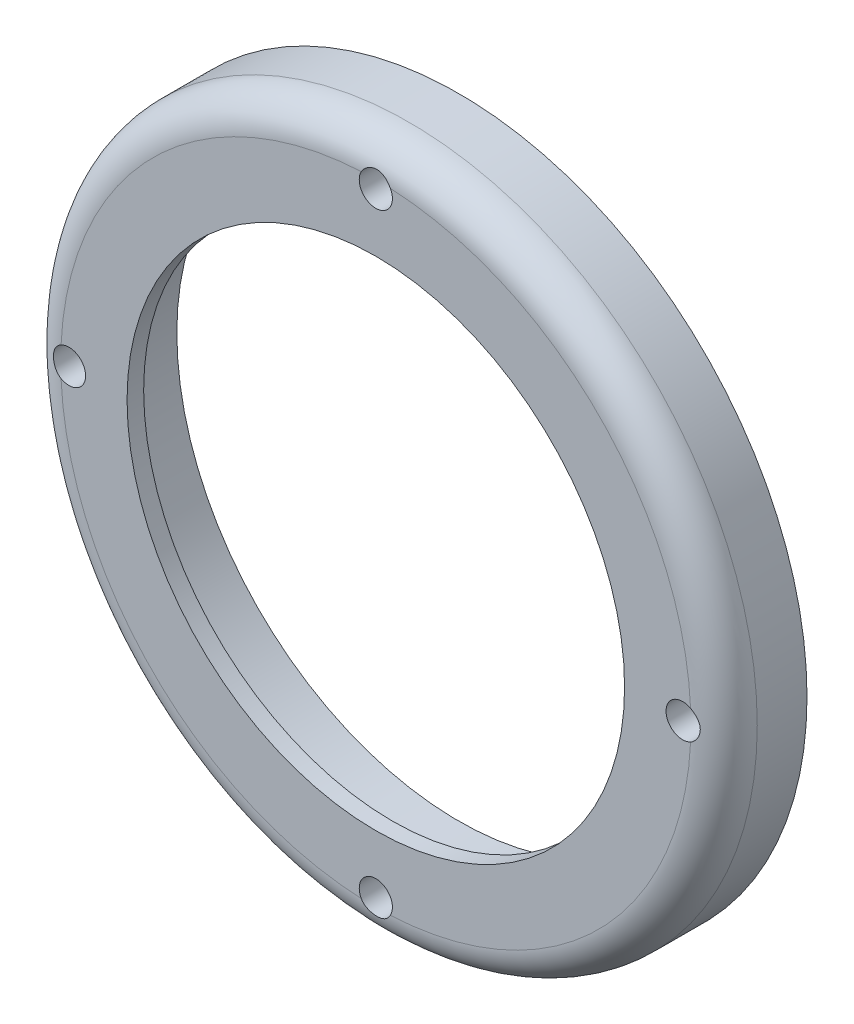
ISO-10303-21;
HEADER;
FILE_DESCRIPTION(('STEP AP214'),'2;1');
FILE_NAME('part.step','',(''),(''),'','','');
FILE_SCHEMA(('AUTOMOTIVE_DESIGN { 1 0 10303 214 1 1 1 1 }'));
ENDSEC;
DATA;
#1=APPLICATION_CONTEXT('core data for automotive mechanical design processes');
#2=APPLICATION_PROTOCOL_DEFINITION('international standard','automotive_design',2000,#1);
#3=PRODUCT_CONTEXT('',#1,'mechanical');
#4=PRODUCT('Part','Part','',(#3));
#5=PRODUCT_RELATED_PRODUCT_CATEGORY('part','',(#4));
#6=PRODUCT_DEFINITION_FORMATION('','',#4);
#7=PRODUCT_DEFINITION_CONTEXT('part definition',#1,'design');
#8=PRODUCT_DEFINITION('design','',#6,#7);
#9=PRODUCT_DEFINITION_SHAPE('','',#8);
#10=(LENGTH_UNIT() NAMED_UNIT(*) SI_UNIT(.MILLI.,.METRE.));
#11=(NAMED_UNIT(*) PLANE_ANGLE_UNIT() SI_UNIT($,.RADIAN.));
#12=(NAMED_UNIT(*) SI_UNIT($,.STERADIAN.) SOLID_ANGLE_UNIT());
#13=UNCERTAINTY_MEASURE_WITH_UNIT(LENGTH_MEASURE(1.E-05),#10,'distance_accuracy_value','');
#14=(GEOMETRIC_REPRESENTATION_CONTEXT(3) GLOBAL_UNCERTAINTY_ASSIGNED_CONTEXT((#13)) GLOBAL_UNIT_ASSIGNED_CONTEXT((#10,
#11,#12)) REPRESENTATION_CONTEXT('',''));
#15=CARTESIAN_POINT('',(0.,0.,0.));
#16=DIRECTION('',(0.,0.,1.));
#17=DIRECTION('',(1.,0.,0.));
#18=AXIS2_PLACEMENT_3D('',#15,#16,#17);
#19=CARTESIAN_POINT('',(0.,0.,20.));
#20=DIRECTION('',(0.,0.,-1.));
#21=DIRECTION('',(-1.,0.,0.));
#22=AXIS2_PLACEMENT_3D('',#19,#20,#21);
#23=CYLINDRICAL_SURFACE('',#22,52.5);
#24=CARTESIAN_POINT('',(0.,0.,7.5));
#25=DIRECTION('',(0.,0.,1.));
#26=DIRECTION('',(1.,0.,0.));
#27=AXIS2_PLACEMENT_3D('',#24,#25,#26);
#28=CIRCLE('',#27,52.5);
#29=CARTESIAN_POINT('',(52.5,0.,7.5));
#30=VERTEX_POINT('',#29);
#31=EDGE_CURVE('E90',#30,#30,#28,.F.);
#32=ORIENTED_EDGE('',*,*,#31,.T.);
#33=EDGE_LOOP('',(#32));
#34=FACE_BOUND('',#33,.T.);
#35=CARTESIAN_POINT('',(0.,0.,0.));
#36=DIRECTION('',(0.,0.,1.));
#37=DIRECTION('',(1.,0.,0.));
#38=AXIS2_PLACEMENT_3D('',#35,#36,#37);
#39=CIRCLE('',#38,52.5);
#40=CARTESIAN_POINT('',(52.5,0.,0.));
#41=VERTEX_POINT('',#40);
#42=EDGE_CURVE('E109',#41,#41,#39,.T.);
#43=ORIENTED_EDGE('',*,*,#42,.T.);
#44=EDGE_LOOP('',(#43));
#45=FACE_BOUND('',#44,.T.);
#46=ADVANCED_FACE('F36',(#34,#45),#23,.T.);
#47=CARTESIAN_POINT('',(0.,0.,0.));
#48=DIRECTION('',(0.,0.,1.));
#49=DIRECTION('',(1.,0.,0.));
#50=AXIS2_PLACEMENT_3D('',#47,#48,#49);
#51=PLANE('',#50);
#52=CARTESIAN_POINT('',(46.25,0.,0.));
#53=DIRECTION('',(0.,0.,1.));
#54=DIRECTION('',(1.,0.,0.));
#55=AXIS2_PLACEMENT_3D('',#52,#53,#54);
#56=CIRCLE('',#55,1.5);
#57=CARTESIAN_POINT('',(47.75,0.,0.));
#58=VERTEX_POINT('',#57);
#59=EDGE_CURVE('E199',#58,#58,#56,.T.);
#60=ORIENTED_EDGE('',*,*,#59,.T.);
#61=EDGE_LOOP('',(#60));
#62=FACE_BOUND('',#61,.T.);
#63=CARTESIAN_POINT('',(-46.25,0.,0.));
#64=DIRECTION('',(0.,0.,1.));
#65=DIRECTION('',(1.,0.,0.));
#66=AXIS2_PLACEMENT_3D('',#63,#64,#65);
#67=CIRCLE('',#66,1.5);
#68=CARTESIAN_POINT('',(-44.75,0.,0.));
#69=VERTEX_POINT('',#68);
#70=EDGE_CURVE('E193',#69,#69,#67,.T.);
#71=ORIENTED_EDGE('',*,*,#70,.T.);
#72=EDGE_LOOP('',(#71));
#73=FACE_BOUND('',#72,.T.);
#74=CARTESIAN_POINT('',(0.,-46.25,0.));
#75=DIRECTION('',(0.,0.,1.));
#76=DIRECTION('',(1.,0.,0.));
#77=AXIS2_PLACEMENT_3D('',#74,#75,#76);
#78=CIRCLE('',#77,1.5);
#79=CARTESIAN_POINT('',(1.5,-46.25,0.));
#80=VERTEX_POINT('',#79);
#81=EDGE_CURVE('E187',#80,#80,#78,.T.);
#82=ORIENTED_EDGE('',*,*,#81,.T.);
#83=EDGE_LOOP('',(#82));
#84=FACE_BOUND('',#83,.T.);
#85=CARTESIAN_POINT('',(0.,46.25,0.));
#86=DIRECTION('',(0.,0.,1.));
#87=DIRECTION('',(1.,0.,0.));
#88=AXIS2_PLACEMENT_3D('',#85,#86,#87);
#89=CIRCLE('',#88,1.5);
#90=CARTESIAN_POINT('',(1.5,46.25,0.));
#91=VERTEX_POINT('',#90);
#92=EDGE_CURVE('E100',#91,#91,#89,.T.);
#93=ORIENTED_EDGE('',*,*,#92,.T.);
#94=EDGE_LOOP('',(#93));
#95=FACE_BOUND('',#94,.T.);
#96=CARTESIAN_POINT('',(0.,0.,0.));
#97=DIRECTION('',(0.,0.,-1.));
#98=DIRECTION('',(-1.,0.,0.));
#99=AXIS2_PLACEMENT_3D('',#96,#97,#98);
#100=CIRCLE('',#99,42.5);
#101=CARTESIAN_POINT('',(-42.5,0.,0.));
#102=VERTEX_POINT('',#101);
#103=EDGE_CURVE('E157',#102,#102,#100,.T.);
#104=ORIENTED_EDGE('',*,*,#103,.F.);
#105=EDGE_LOOP('',(#104));
#106=FACE_BOUND('',#105,.T.);
#107=ORIENTED_EDGE('',*,*,#42,.F.);
#108=EDGE_LOOP('',(#107));
#109=FACE_BOUND('',#108,.T.);
#110=ADVANCED_FACE('F142',(#62,#73,#84,#95,#106,#109),#51,.F.);
#111=CARTESIAN_POINT('',(0.,0.,10.));
#112=DIRECTION('',(0.,0.,-1.));
#113=DIRECTION('',(-1.,0.,0.));
#114=AXIS2_PLACEMENT_3D('',#111,#112,#113);
#115=CYLINDRICAL_SURFACE('',#114,42.5);
#116=CARTESIAN_POINT('',(0.,0.,10.));
#117=DIRECTION('',(0.,0.,-1.));
#118=DIRECTION('',(-1.,0.,0.));
#119=AXIS2_PLACEMENT_3D('',#116,#117,#118);
#120=CIRCLE('',#119,42.5);
#121=CARTESIAN_POINT('',(-42.5,0.,10.));
#122=VERTEX_POINT('',#121);
#123=EDGE_CURVE('E155',#122,#122,#120,.T.);
#124=ORIENTED_EDGE('',*,*,#123,.F.);
#125=EDGE_LOOP('',(#124));
#126=FACE_BOUND('',#125,.T.);
#127=ORIENTED_EDGE('',*,*,#103,.T.);
#128=EDGE_LOOP('',(#127));
#129=FACE_BOUND('',#128,.T.);
#130=ADVANCED_FACE('F138',(#126,#129),#115,.F.);
#131=CARTESIAN_POINT('',(0.,0.,10.));
#132=DIRECTION('',(0.,0.,-1.));
#133=DIRECTION('',(-1.,0.,0.));
#134=AXIS2_PLACEMENT_3D('',#131,#132,#133);
#135=PLANE('',#134);
#136=CARTESIAN_POINT('',(0.,0.,10.));
#137=DIRECTION('',(0.,0.,-1.));
#138=DIRECTION('',(-1.,0.,0.));
#139=AXIS2_PLACEMENT_3D('',#136,#137,#138);
#140=CIRCLE('',#139,37.5);
#141=CARTESIAN_POINT('',(-37.5,0.,10.));
#142=VERTEX_POINT('',#141);
#143=EDGE_CURVE('E164',#142,#142,#140,.T.);
#144=ORIENTED_EDGE('',*,*,#143,.F.);
#145=EDGE_LOOP('',(#144));
#146=FACE_BOUND('',#145,.T.);
#147=ORIENTED_EDGE('',*,*,#123,.T.);
#148=EDGE_LOOP('',(#147));
#149=FACE_BOUND('',#148,.T.);
#150=ADVANCED_FACE('F135',(#146,#149),#135,.T.);
#151=CARTESIAN_POINT('',(0.,0.,12.5));
#152=DIRECTION('',(0.,0.,1.));
#153=DIRECTION('',(1.,0.,0.));
#154=AXIS2_PLACEMENT_3D('',#151,#152,#153);
#155=PLANE('',#154);
#156=CARTESIAN_POINT('',(0.,46.25,12.5));
#157=DIRECTION('',(0.,0.,1.));
#158=DIRECTION('',(1.,0.,0.));
#159=AXIS2_PLACEMENT_3D('',#156,#157,#158);
#160=CIRCLE('',#159,2.5);
#161=CARTESIAN_POINT('',(-2.19354078263524,47.4493243243243,12.5));
#162=VERTEX_POINT('',#161);
#163=CARTESIAN_POINT('',(2.19354078263524,47.4493243243243,12.5));
#164=VERTEX_POINT('',#163);
#165=EDGE_CURVE('E180',#162,#164,#160,.T.);
#166=ORIENTED_EDGE('',*,*,#165,.F.);
#167=CARTESIAN_POINT('',(0.,0.,12.5));
#168=DIRECTION('',(0.,0.,1.));
#169=DIRECTION('',(1.,0.,0.));
#170=AXIS2_PLACEMENT_3D('',#167,#168,#169);
#171=CIRCLE('',#170,47.5);
#172=CARTESIAN_POINT('',(-47.4493243243243,2.19354078263524,12.5));
#173=VERTEX_POINT('',#172);
#174=EDGE_CURVE('E98',#162,#173,#171,.T.);
#175=ORIENTED_EDGE('',*,*,#174,.T.);
#176=CARTESIAN_POINT('',(-46.25,0.,12.5));
#177=DIRECTION('',(0.,0.,1.));
#178=DIRECTION('',(1.,0.,0.));
#179=AXIS2_PLACEMENT_3D('',#176,#177,#178);
#180=CIRCLE('',#179,2.5);
#181=CARTESIAN_POINT('',(-47.4493243243243,-2.19354078263524,12.5));
#182=VERTEX_POINT('',#181);
#183=EDGE_CURVE('E84',#182,#173,#180,.T.);
#184=ORIENTED_EDGE('',*,*,#183,.F.);
#185=CARTESIAN_POINT('',(-2.19354078263524,-47.4493243243243,12.5));
#186=VERTEX_POINT('',#185);
#187=EDGE_CURVE('E97',#182,#186,#171,.T.);
#188=ORIENTED_EDGE('',*,*,#187,.T.);
#189=CARTESIAN_POINT('',(0.,-46.25,12.5));
#190=DIRECTION('',(0.,0.,1.));
#191=DIRECTION('',(1.,0.,0.));
#192=AXIS2_PLACEMENT_3D('',#189,#190,#191);
#193=CIRCLE('',#192,2.5);
#194=CARTESIAN_POINT('',(2.19354078263524,-47.4493243243243,12.5));
#195=VERTEX_POINT('',#194);
#196=EDGE_CURVE('E62',#195,#186,#193,.T.);
#197=ORIENTED_EDGE('',*,*,#196,.F.);
#198=CARTESIAN_POINT('',(47.4493243243243,-2.19354078263524,12.5));
#199=VERTEX_POINT('',#198);
#200=EDGE_CURVE('E105',#195,#199,#171,.T.);
#201=ORIENTED_EDGE('',*,*,#200,.T.);
#202=CARTESIAN_POINT('',(46.25,0.,12.5));
#203=DIRECTION('',(0.,0.,1.));
#204=DIRECTION('',(1.,0.,0.));
#205=AXIS2_PLACEMENT_3D('',#202,#203,#204);
#206=CIRCLE('',#205,2.5);
#207=CARTESIAN_POINT('',(47.4493243243243,2.19354078263524,12.5));
#208=VERTEX_POINT('',#207);
#209=EDGE_CURVE('E55',#208,#199,#206,.T.);
#210=ORIENTED_EDGE('',*,*,#209,.F.);
#211=EDGE_CURVE('E107',#208,#164,#171,.T.);
#212=ORIENTED_EDGE('',*,*,#211,.T.);
#213=EDGE_LOOP('',(#166,#175,#184,#188,#197,#201,#210,#212));
#214=FACE_BOUND('',#213,.T.);
#215=CARTESIAN_POINT('',(0.,0.,12.5));
#216=DIRECTION('',(0.,0.,-1.));
#217=DIRECTION('',(-1.,0.,0.));
#218=AXIS2_PLACEMENT_3D('',#215,#216,#217);
#219=CIRCLE('',#218,37.5);
#220=CARTESIAN_POINT('',(-37.5,0.,12.5));
#221=VERTEX_POINT('',#220);
#222=EDGE_CURVE('E162',#221,#221,#219,.T.);
#223=ORIENTED_EDGE('',*,*,#222,.T.);
#224=EDGE_LOOP('',(#223));
#225=FACE_BOUND('',#224,.T.);
#226=ADVANCED_FACE('F95',(#214,#225),#155,.T.);
#227=CARTESIAN_POINT('',(0.,0.,12.5));
#228=DIRECTION('',(0.,0.,-1.));
#229=DIRECTION('',(-1.,0.,0.));
#230=AXIS2_PLACEMENT_3D('',#227,#228,#229);
#231=CYLINDRICAL_SURFACE('',#230,37.5);
#232=ORIENTED_EDGE('',*,*,#222,.F.);
#233=EDGE_LOOP('',(#232));
#234=FACE_BOUND('',#233,.T.);
#235=ORIENTED_EDGE('',*,*,#143,.T.);
#236=EDGE_LOOP('',(#235));
#237=FACE_BOUND('',#236,.T.);
#238=ADVANCED_FACE('F129',(#234,#237),#231,.F.);
#239=CARTESIAN_POINT('',(0.,0.,7.5));
#240=DIRECTION('',(0.,0.,1.));
#241=DIRECTION('',(1.,0.,0.));
#242=AXIS2_PLACEMENT_3D('',#239,#240,#241);
#243=TOROIDAL_SURFACE('',#242,47.5,5.);
#244=CARTESIAN_POINT('',(-1.40418270651494,44.1816018452135,11.2597595084674));
#245=CARTESIAN_POINT('',(-1.3114488943393,44.1186426591774,11.2020043959019));
#246=CARTESIAN_POINT('',(-1.21355225182356,44.061270164693,11.1461672668494));
#247=CARTESIAN_POINT('',(-1.00731593288184,43.959026218572,11.0422957952221));
#248=CARTESIAN_POINT('',(-0.898966668150176,43.9141663945541,10.9942687274478));
#249=CARTESIAN_POINT('',(-0.695145930001762,43.8467000004861,10.9198048894202));
#250=CARTESIAN_POINT('',(-0.601457741075006,43.8214336939323,10.8909692369789));
#251=CARTESIAN_POINT('',(-0.40911982041811,43.7817578416228,10.8450101785638));
#252=CARTESIAN_POINT('',(-0.310481298826818,43.7673248508224,10.8278614875702));
#253=CARTESIAN_POINT('',(-0.109938511774165,43.750381761955,10.8076789049674));
#254=CARTESIAN_POINT('',(-0.00801558094625604,43.7479600157126,10.8047496111604));
#255=CARTESIAN_POINT('',(0.194719358604004,43.7555270278607,10.8138061058862));
#256=CARTESIAN_POINT('',(0.295530562255162,43.7655242514959,10.8258020680527));
#257=CARTESIAN_POINT('',(0.502899905389215,43.7986255462218,10.8646571744916));
#258=CARTESIAN_POINT('',(0.608986848943493,43.8229688574144,10.8929146839688));
#259=CARTESIAN_POINT('',(0.813764108487216,43.8837254011589,10.9609800045866));
#260=CARTESIAN_POINT('',(0.912437369167845,43.920165479142,11.0008134806713));
#261=CARTESIAN_POINT('',(1.14218047857569,44.0212692462236,11.1066051039355));
#262=CARTESIAN_POINT('',(1.26905512002437,44.0913382213022,11.1764499603316));
#263=CARTESIAN_POINT('',(1.50647165449171,44.2497615382026,11.3227283930393));
#264=CARTESIAN_POINT('',(1.6169896031965,44.3381422411535,11.3991713742624));
#265=CARTESIAN_POINT('',(1.82471664663023,44.534920114695,11.5552317479849));
#266=CARTESIAN_POINT('',(1.9213911088308,44.6438641876363,11.6348728135146));
#267=CARTESIAN_POINT('',(2.09545761934986,44.8787331881972,11.7898924019857));
#268=CARTESIAN_POINT('',(2.17287187675999,45.004638297132,11.8652757562299));
#269=CARTESIAN_POINT('',(2.29795313285243,45.256606575861,11.9993177362122));
#270=CARTESIAN_POINT('',(2.34802162688877,45.3809757909418,12.0589025260389));
#271=CARTESIAN_POINT('',(2.42820743464258,45.6399582939292,12.1686611258076));
#272=CARTESIAN_POINT('',(2.45833362957443,45.7745669919089,12.2188391178789));
#273=CARTESIAN_POINT('',(2.49605462431406,46.051609919271,12.3077964333225));
#274=CARTESIAN_POINT('',(2.50350573202309,46.1940882535696,12.346501665419));
#275=CARTESIAN_POINT('',(2.49342317176478,46.4811303881585,12.4107098595447));
#276=CARTESIAN_POINT('',(2.47590342359094,46.6256929821388,12.4362201661726));
#277=CARTESIAN_POINT('',(2.41877793740692,46.8952617423786,12.4721052558632));
#278=CARTESIAN_POINT('',(2.38183470069148,47.0206598785442,12.4838439799693));
#279=CARTESIAN_POINT('',(2.28859644726252,47.2645776106169,12.4981903556719));
#280=CARTESIAN_POINT('',(2.23230219326361,47.3830974774137,12.5007983671074));
#281=CARTESIAN_POINT('',(2.1027873231934,47.6082879836303,12.498794412231));
#282=CARTESIAN_POINT('',(2.02979999133948,47.7150944044581,12.4942773136641));
#283=CARTESIAN_POINT('',(1.86843149979942,47.9160062401028,12.4804488221296));
#284=CARTESIAN_POINT('',(1.78004644392617,48.010108429562,12.4711362145535));
#285=CARTESIAN_POINT('',(1.58431920527593,48.1886890509281,12.4494707636825));
#286=CARTESIAN_POINT('',(1.47615849172945,48.2722530671233,12.4369691951711));
#287=CARTESIAN_POINT('',(1.24766718689563,48.4206902517879,12.4120205130267));
#288=CARTESIAN_POINT('',(1.12733391083831,48.4855592847111,12.3995734120415));
#289=CARTESIAN_POINT('',(0.873106182390517,48.596826717458,12.3767971613134));
#290=CARTESIAN_POINT('',(0.738884499987027,48.642499193526,12.3665573858781));
#291=CARTESIAN_POINT('',(0.46440137359252,48.710551713858,12.3508548922604));
#292=CARTESIAN_POINT('',(0.324141226655927,48.7329367344984,12.3453911535101));
#293=CARTESIAN_POINT('',(0.0447287835424502,48.7534390823493,12.3403955859416));
#294=CARTESIAN_POINT('',(-0.0943845832494725,48.7520578116846,12.3407411926036));
#295=CARTESIAN_POINT('',(-0.370330582874217,48.726299328413,12.3469961061305));
#296=CARTESIAN_POINT('',(-0.50716323528208,48.7019223132788,12.3529053652184));
#297=CARTESIAN_POINT('',(-0.773080045928542,48.6313974148588,12.3690419200716));
#298=CARTESIAN_POINT('',(-0.902236191368962,48.5855078867915,12.3792178262308));
#299=CARTESIAN_POINT('',(-1.15118047338923,48.4733823294901,12.4019408578285));
#300=CARTESIAN_POINT('',(-1.27096653025545,48.4071417992878,12.4144885075816));
#301=CARTESIAN_POINT('',(-1.50119141974742,48.2540062857087,12.4397984557992));
#302=CARTESIAN_POINT('',(-1.61129664979759,48.1666085335768,12.4525575796356));
#303=CARTESIAN_POINT('',(-1.81551000848431,47.9744072761336,12.4749311288706));
#304=CARTESIAN_POINT('',(-1.90961774344956,47.8696033426111,12.484545476887));
#305=CARTESIAN_POINT('',(-2.07888826529424,47.6456611505452,12.4975281221853));
#306=CARTESIAN_POINT('',(-2.15409435624998,47.5265565982938,12.5009108110871));
#307=CARTESIAN_POINT('',(-2.28340212027072,47.2774887678149,12.4986645250932));
#308=CARTESIAN_POINT('',(-2.33751576200066,47.1475316987088,12.4930406701393));
#309=CARTESIAN_POINT('',(-2.42050685527532,46.8891164903566,12.4713617459052));
#310=CARTESIAN_POINT('',(-2.45068405269035,46.7610216934409,12.4559412124993));
#311=CARTESIAN_POINT('',(-2.49053659200265,46.5033987045804,12.4144535319324));
#312=CARTESIAN_POINT('',(-2.50021501553844,46.3738707310326,12.3883879857689));
#313=CARTESIAN_POINT('',(-2.49978403511352,46.1213078991045,12.326763460412));
#314=CARTESIAN_POINT('',(-2.49025918628236,45.9981947979225,12.2915125307169));
#315=CARTESIAN_POINT('',(-2.45403407907984,45.7575175472017,12.2122031241409));
#316=CARTESIAN_POINT('',(-2.42733220844903,45.6399539196562,12.1681438207611));
#317=CARTESIAN_POINT('',(-2.35598801626241,45.4040486848168,12.0691662184732));
#318=CARTESIAN_POINT('',(-2.31014980138759,45.2863106990884,12.0136811585003));
#319=CARTESIAN_POINT('',(-2.20289729006621,45.0613868096178,11.8965115252379));
#320=CARTESIAN_POINT('',(-2.14146242303205,44.9542151030537,11.8348188300093));
#321=CARTESIAN_POINT('',(-1.99364308038422,44.7348577613838,11.6973176579227));
#322=CARTESIAN_POINT('',(-1.90481898204736,44.6247338350317,11.6208537848455));
#323=CARTESIAN_POINT('',(-1.71046379589754,44.4213219694147,11.4673310010446));
#324=CARTESIAN_POINT('',(-1.60497031040958,44.3279971252598,11.3902737922517));
#325=CARTESIAN_POINT('',(-1.46289190273117,44.2223883516137,11.2968475573807));
#326=CARTESIAN_POINT('',(-1.4338006288457,44.2017101556374,11.2782057083813));
#327=CARTESIAN_POINT('',(-1.40418270651494,44.1816018452135,11.2597595084674));
#328=B_SPLINE_CURVE_WITH_KNOTS('',3,(#244,#245,#246,#247,#248,#249,#250,#251,#252,#253,#254,
#255,#256,#257,#258,#259,#260,#261,#262,#263,#264,#265,#266,#267,#268,#269,#270,#271,#272,#273,
#274,#275,#276,#277,#278,#279,#280,#281,#282,#283,#284,#285,#286,#287,#288,#289,#290,#291,#292,
#293,#294,#295,#296,#297,#298,#299,#300,#301,#302,#303,#304,#305,#306,#307,#308,#309,#310,#311,
#312,#313,#314,#315,#316,#317,#318,#319,#320,#321,#322,#323,#324,#325,#326,#327),.UNSPECIFIED.,
.T.,.F.,(4,2,2,2,2,2,2,2,2,2,2,2,2,2,2,2,2,2,2,2,2,2,2,2,2,2,2,2,2,2,2,2,2,2,2,2,2,2,2,2,2,4),
(0.,0.378206297057353,0.756762886868923,1.05929995961715,1.36118039038334,1.66527812126384,
1.96958325057168,2.30510226709332,2.64137090935228,3.12146938127928,3.60226385440161,
4.0983393357914,4.59384010946465,5.03217678411966,5.47031811591458,5.91123022901136,
6.35189665546633,6.7437323211395,7.13555254449644,7.52219972952993,7.90894489291783,
8.31886188459676,8.72886948516568,9.15322712069446,9.57749405514328,9.99282132985437,
10.4081450380343,10.8186038988097,11.2291536049316,11.6506294325395,12.0721156304535,
12.4926272066672,12.9128998198928,13.3083946230496,13.7038299661355,14.0874098481606,
14.4710257387876,14.8834281701937,15.2963773751659,15.7770708373226,16.2566950505656,
16.3774890141528),.UNSPECIFIED.);
#329=EDGE_CURVE('E11',#164,#162,#328,.T.);
#330=ORIENTED_EDGE('',*,*,#329,.F.);
#331=ORIENTED_EDGE('',*,*,#211,.F.);
#332=CARTESIAN_POINT('',(44.1816018452135,-1.40418270651495,11.2597595084674));
#333=CARTESIAN_POINT('',(44.226125940777,-1.46976375037793,11.30060183343));
#334=CARTESIAN_POINT('',(44.2734593277646,-1.53279059217128,11.3424167285021));
#335=CARTESIAN_POINT('',(44.3735039238871,-1.65376049271652,11.426954073738));
#336=CARTESIAN_POINT('',(44.4262147293912,-1.71170393242385,11.4696764555953));
#337=CARTESIAN_POINT('',(44.536880823653,-1.82245890163134,11.5551662411721));
#338=CARTESIAN_POINT('',(44.5948414650545,-1.87526507689313,11.5979336458836));
#339=CARTESIAN_POINT('',(44.7158135372721,-1.97545933362956,11.6826835485914));
#340=CARTESIAN_POINT('',(44.7788251584059,-2.02284721078285,11.7246660169382));
#341=CARTESIAN_POINT('',(44.9100878734916,-2.11210021671493,11.8073453517497));
#342=CARTESIAN_POINT('',(44.9783655685877,-2.15393394821422,11.8480339962215));
#343=CARTESIAN_POINT('',(45.1195886274024,-2.23128850427208,11.9271712640827));
#344=CARTESIAN_POINT('',(45.1925315238832,-2.26681262878883,11.9656210512913));
#345=CARTESIAN_POINT('',(45.3426532559037,-2.33095869945796,12.0395803801175));
#346=CARTESIAN_POINT('',(45.4198244815898,-2.35959257574246,12.0750949329004));
#347=CARTESIAN_POINT('',(45.5779650695974,-2.40940771401967,12.1426225408441));
#348=CARTESIAN_POINT('',(45.6589329535599,-2.4305918499576,12.1746369429941));
#349=CARTESIAN_POINT('',(45.8638361221669,-2.47314599437481,12.2490754687088));
#350=CARTESIAN_POINT('',(45.9897068259462,-2.48970475086591,12.289100315443));
#351=CARTESIAN_POINT('',(46.2452467917749,-2.50326534977598,12.3588573082303));
#352=CARTESIAN_POINT('',(46.3749138290307,-2.50027842702366,12.3885953567717));
#353=CARTESIAN_POINT('',(46.6345156366873,-2.47370203754332,12.4373437057977));
#354=CARTESIAN_POINT('',(46.7644503081216,-2.45006345456795,12.4563282534684));
#355=CARTESIAN_POINT('',(47.0199610859294,-2.38215005201105,12.4839595682392));
#356=CARTESIAN_POINT('',(47.1455366048275,-2.33787246245915,12.4926049471593));
#357=CARTESIAN_POINT('',(47.3837022470445,-2.23183359571882,12.5009004363289));
#358=CARTESIAN_POINT('',(47.4966025777209,-2.17078932313103,12.5008753508388));
#359=CARTESIAN_POINT('',(47.7116061402741,-2.03225785036779,12.4945954668476));
#360=CARTESIAN_POINT('',(47.8137075936391,-1.95476794799232,12.4883396439423));
#361=CARTESIAN_POINT('',(48.0091644702717,-1.78134725652249,12.4714684843398));
#362=CARTESIAN_POINT('',(48.1018888159595,-1.68472429584657,12.4606632086443));
#363=CARTESIAN_POINT('',(48.2706880997316,-1.47805107379457,12.4373623584765));
#364=CARTESIAN_POINT('',(48.3467578463332,-1.3679966422342,12.424866258908));
#365=CARTESIAN_POINT('',(48.4839266543527,-1.13104702938719,12.4000772921986));
#366=CARTESIAN_POINT('',(48.5440369188672,-1.00357263018101,12.3878290869033));
#367=CARTESIAN_POINT('',(48.6420734551901,-0.740092923551822,12.3667745477483));
#368=CARTESIAN_POINT('',(48.6800021619794,-0.604088554321993,12.3579678361338));
#369=CARTESIAN_POINT('',(48.7323033098499,-0.328250320898307,12.3456004087703));
#370=CARTESIAN_POINT('',(48.7468203957874,-0.188445440481493,12.3420074943641));
#371=CARTESIAN_POINT('',(48.7522423405801,0.0916375959548406,12.3406804187639));
#372=CARTESIAN_POINT('',(48.7431501866768,0.231915689856444,12.3429455163642));
#373=CARTESIAN_POINT('',(48.702168960899,0.505531813678127,12.3527628548014));
#374=CARTESIAN_POINT('',(48.6708165970307,0.638955401901087,12.360190535282));
#375=CARTESIAN_POINT('',(48.5868813731617,0.898675902005812,12.3787915233668));
#376=CARTESIAN_POINT('',(48.5342948740136,1.02497158806299,12.389965472958));
#377=CARTESIAN_POINT('',(48.4082257431717,1.26937289560785,12.4141363570978));
#378=CARTESIAN_POINT('',(48.3343850490173,1.38729086594331,12.4271624079962));
#379=CARTESIAN_POINT('',(48.1681173564055,1.6093696913165,12.4521362582476));
#380=CARTESIAN_POINT('',(48.0756870928831,1.71352812430208,12.4640838676487));
#381=CARTESIAN_POINT('',(47.8729487261876,1.90681933624304,12.4840762326983));
#382=CARTESIAN_POINT('',(47.7623767637597,1.99568322190362,12.4920550598104));
#383=CARTESIAN_POINT('',(47.5275990075897,2.1535378150232,12.5007121405057));
#384=CARTESIAN_POINT('',(47.403399057196,2.22253699435023,12.5013935107983));
#385=CARTESIAN_POINT('',(47.1511988320616,2.33582543635622,12.4929755655847));
#386=CARTESIAN_POINT('',(47.0236218710512,2.38108790229531,12.4843155163118));
#387=CARTESIAN_POINT('',(46.7639649678092,2.45028044897006,12.4563151535357));
#388=CARTESIAN_POINT('',(46.6318868778311,2.47421919712541,12.4369791846392));
#389=CARTESIAN_POINT('',(46.3746329946595,2.50006300272066,12.3884155511876));
#390=CARTESIAN_POINT('',(46.2494556217126,2.50304965483613,12.3597548883431));
#391=CARTESIAN_POINT('',(46.0026243757897,2.49080013065237,12.2928611037754));
#392=CARTESIAN_POINT('',(45.8809712762407,2.47555998492036,12.254625898342));
#393=CARTESIAN_POINT('',(45.6396065428541,2.42757710458655,12.1682050585975));
#394=CARTESIAN_POINT('',(45.5201368155576,2.39420237768205,12.1197013181082));
#395=CARTESIAN_POINT('',(45.2901897191999,2.31164543023222,12.015548975722));
#396=CARTESIAN_POINT('',(45.1797138905166,2.26246050899569,11.9598991541103));
#397=CARTESIAN_POINT('',(44.9542406588134,2.14232232813193,11.8353925919159));
#398=CARTESIAN_POINT('',(44.8407788125165,2.06928454257749,11.7657779122043));
#399=CARTESIAN_POINT('',(44.6279901042221,1.9071005319541,11.6231864757845));
#400=CARTESIAN_POINT('',(44.5286922212289,1.81792210555825,11.5502032194709));
#401=CARTESIAN_POINT('',(44.3835050231777,1.66500118798656,11.4351982948866));
#402=CARTESIAN_POINT('',(44.3325896385957,1.60612322638815,11.3929347424292));
#403=CARTESIAN_POINT('',(44.2360896363442,1.4833293721939,11.3095376483656));
#404=CARTESIAN_POINT('',(44.1905069495562,1.41941166872769,11.2684045201664));
#405=CARTESIAN_POINT('',(44.1050964068095,1.28670157652801,11.1884892451685));
#406=CARTESIAN_POINT('',(44.0652557369219,1.21792056905015,11.1497019793136));
#407=CARTESIAN_POINT('',(43.9916645904398,1.0753397790548,11.0757631305343));
#408=CARTESIAN_POINT('',(43.9579119134856,1.00154182312543,11.0406102360215));
#409=CARTESIAN_POINT('',(43.8919206227556,0.835884983106909,10.9700630017654));
#410=CARTESIAN_POINT('',(43.8609232978472,0.743093096531329,10.9356511508805));
#411=CARTESIAN_POINT('',(43.8095793197389,0.551493765973776,10.8774600005558));
#412=CARTESIAN_POINT('',(43.7892121446955,0.452698326996926,10.8536602272056));
#413=CARTESIAN_POINT('',(43.7603999562862,0.249911172603905,10.8196989080548));
#414=CARTESIAN_POINT('',(43.752077825943,0.145876951418759,10.8096779843804));
#415=CARTESIAN_POINT('',(43.7486134475741,-0.0627369389040942,10.8055288181167));
#416=CARTESIAN_POINT('',(43.7534686471105,-0.167316498493789,10.811397497724));
#417=CARTESIAN_POINT('',(43.7744396448105,-0.360372909375463,10.8362799704688));
#418=CARTESIAN_POINT('',(43.7890960652604,-0.44924753707585,10.8535871086068));
#419=CARTESIAN_POINT('',(43.8271626637556,-0.622699855548784,10.8974983333848));
#420=CARTESIAN_POINT('',(43.8505794692935,-0.707274237892053,10.924109457768));
#421=CARTESIAN_POINT('',(43.9152571691499,-0.901679890714053,10.9954405316309));
#422=CARTESIAN_POINT('',(43.9599150982692,-1.00924133159296,11.0432161069376));
#423=CARTESIAN_POINT('',(44.0617073908905,-1.21429976503464,11.1465939508878));
#424=CARTESIAN_POINT('',(44.1188658656856,-1.31177676377467,11.2022112701417));
#425=CARTESIAN_POINT('',(44.1816018452135,-1.40418270651495,11.2597595084674));
#426=B_SPLINE_CURVE_WITH_KNOTS('',3,(#332,#333,#334,#335,#336,#337,#338,#339,#340,#341,#342,
#343,#344,#345,#346,#347,#348,#349,#350,#351,#352,#353,#354,#355,#356,#357,#358,#359,#360,#361,
#362,#363,#364,#365,#366,#367,#368,#369,#370,#371,#372,#373,#374,#375,#376,#377,#378,#379,#380,
#381,#382,#383,#384,#385,#386,#387,#388,#389,#390,#391,#392,#393,#394,#395,#396,#397,#398,#399,
#400,#401,#402,#403,#404,#405,#406,#407,#408,#409,#410,#411,#412,#413,#414,#415,#416,#417,#418,
#419,#420,#421,#422,#423,#424,#425),.UNSPECIFIED.,.T.,.F.,(4,2,2,2,2,2,2,2,2,2,2,2,2,2,2,2,2,2,
2,2,2,2,2,2,2,2,2,2,2,2,2,2,2,2,2,2,2,2,2,2,2,2,2,2,2,2,4),(0.,0.267384064069418,
0.534748072951744,0.802387817997865,1.0700376522804,1.33914133626007,1.60810386046368,
1.87659728303663,2.14498701285935,2.54246520886232,2.93971495503867,3.33791206796504,
3.73616263849935,4.119496024223,4.50289244472085,4.90419276368749,5.30561799630781,
5.72799848889805,6.15033260595487,6.5700472638176,6.98970881840259,7.39958134691629,
7.80952415001413,8.22682370938274,8.64419662719965,9.06828882564696,9.49219988909628,
9.89701248640849,10.3016604649666,10.6852548818332,11.0689328531219,11.4669301995759,
11.8649955679415,12.3188390586899,12.7735981739833,13.0390561562423,13.304609960879,
13.5695616597844,13.8344174054944,14.1444705407634,14.4539228736423,14.7665104982513,
15.0790375792201,15.3531020051119,15.6273741895826,16.0033957406695,16.3801490684403),.UNSPECIFIED.);
#427=EDGE_CURVE('E49',#199,#208,#426,.T.);
#428=ORIENTED_EDGE('',*,*,#427,.F.);
#429=ORIENTED_EDGE('',*,*,#200,.F.);
#430=CARTESIAN_POINT('',(-1.72372791453471,-48.0607352309639,12.4648732267978));
#431=CARTESIAN_POINT('',(-1.62209482081715,-48.1574712608664,12.453785887876));
#432=CARTESIAN_POINT('',(-1.51224585674772,-48.2456853678386,12.4410551665245));
#433=CARTESIAN_POINT('',(-1.2791227433335,-48.4025988199724,12.4153477821257));
#434=CARTESIAN_POINT('',(-1.15581343549666,-48.4712452818483,12.4023705518351));
#435=CARTESIAN_POINT('',(-0.899213326400894,-48.5869193733378,12.3789351630288));
#436=CARTESIAN_POINT('',(-0.765925557233787,-48.6339535393845,12.3684762433302));
#437=CARTESIAN_POINT('',(-0.493169541751297,-48.7049181833507,12.3521987348202));
#438=CARTESIAN_POINT('',(-0.353706794889502,-48.7288688032525,12.3463761013029));
#439=CARTESIAN_POINT('',(-0.0749493319415042,-48.7527232570298,12.34057504372));
#440=CARTESIAN_POINT('',(0.0643097955586253,-48.7530193942667,12.3405012767206));
#441=CARTESIAN_POINT('',(0.340851386590858,-48.7305380115423,12.3459717543202));
#442=CARTESIAN_POINT('',(0.47813361760037,-48.7077577994627,12.3515166544005));
#443=CARTESIAN_POINT('',(0.744989058177351,-48.6403319359413,12.3670394420803));
#444=CARTESIAN_POINT('',(0.874640217282266,-48.5959794859167,12.3769577240928));
#445=CARTESIAN_POINT('',(1.12480822174392,-48.4868368907797,12.3993244144646));
#446=CARTESIAN_POINT('',(1.24532325292201,-48.4220426996273,12.4117733235381));
#447=CARTESIAN_POINT('',(1.47718545758253,-48.2717573558792,12.4370724794593));
#448=CARTESIAN_POINT('',(1.58821136041205,-48.1857702703112,12.4499247226127));
#449=CARTESIAN_POINT('',(1.794502665059,-47.9962462725069,12.4727120150109));
#450=CARTESIAN_POINT('',(1.8897673467125,-47.892708558782,12.4826469309728));
#451=CARTESIAN_POINT('',(2.06176897572823,-47.6708450467074,12.4965161512351));
#452=CARTESIAN_POINT('',(2.13850718436623,-47.5525202558895,12.5004508641243));
#453=CARTESIAN_POINT('',(2.27097708932296,-47.3046917556956,12.4994677139345));
#454=CARTESIAN_POINT('',(2.32672044842473,-47.175194302099,12.4945547745832));
#455=CARTESIAN_POINT('',(2.41294065683628,-46.9171867818805,12.4743272410659));
#456=CARTESIAN_POINT('',(2.44469428993241,-46.7890542160918,12.4596317972039));
#457=CARTESIAN_POINT('',(2.48759053952654,-46.5310472206605,12.4195685244839));
#458=CARTESIAN_POINT('',(2.498737353036,-46.4011731511405,12.3942028701307));
#459=CARTESIAN_POINT('',(2.50102198605362,-46.1480542972951,12.3339517465189));
#460=CARTESIAN_POINT('',(2.49280603422749,-46.0247319862981,12.2994069341553));
#461=CARTESIAN_POINT('',(2.45909655221914,-45.7834148612819,12.2214211828713));
#462=CARTESIAN_POINT('',(2.43359876736541,-45.6654213668135,12.1779780550833));
#463=CARTESIAN_POINT('',(2.36474963720326,-45.4289023743202,12.0803318500675));
#464=CARTESIAN_POINT('',(2.32025443271715,-45.3109393865395,12.0255822719139));
#465=CARTESIAN_POINT('',(2.21570655294481,-45.0854784397295,11.9098107938527));
#466=CARTESIAN_POINT('',(2.15564511242001,-44.9779864239027,11.8487853717773));
#467=CARTESIAN_POINT('',(2.01101634156662,-44.7580815798857,11.7127508563292));
#468=CARTESIAN_POINT('',(1.92406158368763,-44.6476561108992,11.637070957042));
#469=CARTESIAN_POINT('',(1.73337157158297,-44.4430649673549,11.4846090233801));
#470=CARTESIAN_POINT('',(1.62962021013493,-44.3489150813895,11.4078259962069));
#471=CARTESIAN_POINT('',(1.41668699608355,-44.1862153677757,11.2655213998773));
#472=CARTESIAN_POINT('',(1.30896976342218,-44.1160794745566,11.1996246108349));
#473=CARTESIAN_POINT('',(1.08020553113603,-43.9916726261852,11.0765220324624));
#474=CARTESIAN_POINT('',(0.959185638932568,-43.9373702024267,11.0192991142975));
#475=CARTESIAN_POINT('',(0.742016354480833,-43.8607653025728,10.9355923009537));
#476=CARTESIAN_POINT('',(0.649130439097383,-43.8337486836466,10.9050247753609));
#477=CARTESIAN_POINT('',(0.458024013365319,-43.7903709725955,10.855117139591));
#478=CARTESIAN_POINT('',(0.359812811676907,-43.7739918976112,10.835758087439));
#479=CARTESIAN_POINT('',(0.159494222474535,-43.7530491731124,10.8108882584519));
#480=CARTESIAN_POINT('',(0.0573615226455039,-43.7485833386994,10.8054921367069));
#481=CARTESIAN_POINT('',(-0.146363948377654,-43.7522088671369,10.8098356222239));
#482=CARTESIAN_POINT('',(-0.247956612842115,-43.7603026259152,10.8195781174011));
#483=CARTESIAN_POINT('',(-0.436724109908711,-43.7867876276169,10.8508072223707));
#484=CARTESIAN_POINT('',(-0.524297944093882,-43.8040174971883,10.870963744378));
#485=CARTESIAN_POINT('',(-0.694849018086375,-43.846891794054,10.9198689228906));
#486=CARTESIAN_POINT('',(-0.777822219033177,-43.8725434822482,10.9486249916111));
#487=CARTESIAN_POINT('',(-0.988704576115806,-43.94960958227,11.0323312000885));
#488=CARTESIAN_POINT('',(-1.11233871368995,-44.0071110051528,11.0924283127327));
#489=CARTESIAN_POINT('',(-1.34553009879967,-44.1387092611902,11.2211692956653));
#490=CARTESIAN_POINT('',(-1.45505447656409,-44.2128437799437,11.289832414594));
#491=CARTESIAN_POINT('',(-1.66376713661848,-44.3790910906758,11.4326715981876));
#492=CARTESIAN_POINT('',(-1.76243768825844,-44.4717575741411,11.5069572537429));
#493=CARTESIAN_POINT('',(-1.94407974890763,-44.6723925360556,11.6542413294802));
#494=CARTESIAN_POINT('',(-2.02704941876663,-44.7803628045528,11.7272395979548));
#495=CARTESIAN_POINT('',(-2.1448956693054,-44.9631792369491,11.8391071200534));
#496=CARTESIAN_POINT('',(-2.18550900396225,-45.0333617773902,11.8796542199106));
#497=CARTESIAN_POINT('',(-2.26016906264008,-45.1784191485209,11.9582960074495));
#498=CARTESIAN_POINT('',(-2.29421883972498,-45.2532917760199,11.9963918298319));
#499=CARTESIAN_POINT('',(-2.35513675939883,-45.4072809953398,12.0694320339615));
#500=CARTESIAN_POINT('',(-2.3820124762034,-45.486393004468,12.1043797134061));
#501=CARTESIAN_POINT('',(-2.42797350793856,-45.6483103872844,12.1705313904515));
#502=CARTESIAN_POINT('',(-2.44706224319166,-45.7311141216668,12.2017370274303));
#503=CARTESIAN_POINT('',(-2.48359847745196,-45.938172869364,12.2731306286699));
#504=CARTESIAN_POINT('',(-2.496342666115,-46.0641373836237,12.310940402063));
#505=CARTESIAN_POINT('',(-2.5022932439877,-46.3190762611688,12.3762365956281));
#506=CARTESIAN_POINT('',(-2.49551599857974,-46.4480480134695,12.4037316410891));
#507=CARTESIAN_POINT('',(-2.461600429771,-46.7054018632307,12.4481534117036));
#508=CARTESIAN_POINT('',(-2.43442571344126,-46.8337824936083,12.4650611480861));
#509=CARTESIAN_POINT('',(-2.35987865346351,-47.0855996417661,12.4889131154409));
#510=CARTESIAN_POINT('',(-2.31249134779024,-47.2090324227917,12.4958499489666));
#511=CARTESIAN_POINT('',(-2.20036579388301,-47.4436710721544,12.5012754582168));
#512=CARTESIAN_POINT('',(-2.13614413931001,-47.5551208127184,12.4999926690155));
#513=CARTESIAN_POINT('',(-1.99160782020435,-47.7665212491956,12.4915588221262));
#514=CARTESIAN_POINT('',(-1.91132660391317,-47.8664951764643,12.484419867172));
#515=CARTESIAN_POINT('',(-1.79160587534803,-47.9942546213426,12.4721925175466));
#516=CARTESIAN_POINT('',(-1.75813778482606,-48.02798335734,12.4686270620912));
#517=CARTESIAN_POINT('',(-1.72372791453471,-48.0607352309639,12.4648732267978));
#518=B_SPLINE_CURVE_WITH_KNOTS('',3,(#430,#431,#432,#433,#434,#435,#436,#437,#438,#439,#440,
#441,#442,#443,#444,#445,#446,#447,#448,#449,#450,#451,#452,#453,#454,#455,#456,#457,#458,#459,
#460,#461,#462,#463,#464,#465,#466,#467,#468,#469,#470,#471,#472,#473,#474,#475,#476,#477,#478,
#479,#480,#481,#482,#483,#484,#485,#486,#487,#488,#489,#490,#491,#492,#493,#494,#495,#496,#497,
#498,#499,#500,#501,#502,#503,#504,#505,#506,#507,#508,#509,#510,#511,#512,#513,#514,#515,#516,
#517),.UNSPECIFIED.,.T.,.F.,(4,2,2,2,2,2,2,2,2,2,2,2,2,2,2,2,2,2,2,2,2,2,2,2,2,2,2,2,2,2,2,2,2,
2,2,2,2,2,2,2,2,2,2,4),(0.,0.422115953258547,0.845362124164857,1.268480203908,1.69122874886268,
2.10696463970133,2.52274903643811,2.93303382016258,3.34339986268269,3.76447363222542,
4.18556663621995,4.60663096426182,5.02746104197368,5.42390878224167,5.82027576870413,
6.20360231862449,6.58702327526944,6.99779625544425,7.4088010434633,7.88588491308567,
8.36342902556437,8.79537203189589,9.22645061801514,9.52972866146161,9.83249266697423,
10.1377350098645,10.4430355893962,10.7165112033808,10.99022321719,11.4347655240234,
11.8803253877777,12.3420154667128,12.8037595930918,13.0754020682918,13.3469178814248,
13.6181458900345,13.8892546369348,14.2837849032393,14.6779845197051,15.072889139304,
15.4680865890214,15.8523447309353,16.235810734711,16.37872634092),.UNSPECIFIED.);
#519=EDGE_CURVE('E89',#186,#195,#518,.T.);
#520=ORIENTED_EDGE('',*,*,#519,.F.);
#521=ORIENTED_EDGE('',*,*,#187,.F.);
#522=CARTESIAN_POINT('',(-48.0607352309639,-1.72372791453471,12.4648732267978));
#523=CARTESIAN_POINT('',(-47.9689087185217,-1.82017742676361,12.4753955608343));
#524=CARTESIAN_POINT('',(-47.8691392099177,-1.90950489696917,12.4844634844889));
#525=CARTESIAN_POINT('',(-47.6561987212412,-2.07136568675373,12.4970209583132));
#526=CARTESIAN_POINT('',(-47.5429979847761,-2.14386062365503,12.5004978643074));
#527=CARTESIAN_POINT('',(-47.3062140261945,-2.26989094355639,12.4993862215276));
#528=CARTESIAN_POINT('',(-47.1826141121281,-2.32339509708307,12.4947844609542));
#529=CARTESIAN_POINT('',(-46.929217189051,-2.4096800004261,12.4755862245414));
#530=CARTESIAN_POINT('',(-46.7994259303384,-2.44247959181658,12.4609988610811));
#531=CARTESIAN_POINT('',(-46.5431823362168,-2.48601294144706,12.4216712169514));
#532=CARTESIAN_POINT('',(-46.4168037215595,-2.49757578071939,12.3973597681376));
#533=CARTESIAN_POINT('',(-46.1660827973637,-2.50173715548929,12.3387279917464));
#534=CARTESIAN_POINT('',(-46.0417409889613,-2.49433109236521,12.3044052389209));
#535=CARTESIAN_POINT('',(-45.7967362480272,-2.4617147737615,12.2261698466276));
#536=CARTESIAN_POINT('',(-45.6761445846133,-2.43626816326781,12.1821353046921));
#537=CARTESIAN_POINT('',(-45.4428432234719,-2.36922924457772,12.0863388605946));
#538=CARTESIAN_POINT('',(-45.3301351524897,-2.32763361563215,12.0345753704644));
#539=CARTESIAN_POINT('',(-45.1010345470897,-2.2243054696485,11.918584827151));
#540=CARTESIAN_POINT('',(-44.9858517492633,-2.16074309116709,11.8536075692469));
#541=CARTESIAN_POINT('',(-44.7684323137852,-2.01789832261718,11.7191969003568));
#542=CARTESIAN_POINT('',(-44.6662137236746,-1.93859440394633,11.6497574757189));
#543=CARTESIAN_POINT('',(-44.4590302666959,-1.75078616537148,11.4975526331584));
#544=CARTESIAN_POINT('',(-44.3566528862001,-1.63960348615875,11.4145611511259));
#545=CARTESIAN_POINT('',(-44.1721863714353,-1.39846866151055,11.2532832527872));
#546=CARTESIAN_POINT('',(-44.0900783521898,-1.26853416741523,11.1749925086732));
#547=CARTESIAN_POINT('',(-43.9729274465434,-1.03709369876712,11.0566654792807));
#548=CARTESIAN_POINT('',(-43.9313704681915,-0.940917545240649,11.0126668678556));
#549=CARTESIAN_POINT('',(-43.8598477539387,-0.74056226505251,10.9346598364724));
#550=CARTESIAN_POINT('',(-43.8298572272022,-0.636400834908791,10.9006300879466));
#551=CARTESIAN_POINT('',(-43.7873110047971,-0.439847234218003,10.851506818816));
#552=CARTESIAN_POINT('',(-43.7726517695481,-0.348485437915199,10.8341711451389));
#553=CARTESIAN_POINT('',(-43.7536036520454,-0.163241943920912,10.811541743165));
#554=CARTESIAN_POINT('',(-43.749204653605,-0.0693628206941256,10.8062361538261));
#555=CARTESIAN_POINT('',(-43.7510341387027,0.118228729981449,10.808428349422));
#556=CARTESIAN_POINT('',(-43.75727321342,0.211940898210348,10.8159388940016));
#557=CARTESIAN_POINT('',(-43.7798765908509,0.396432338901745,10.842695795463));
#558=CARTESIAN_POINT('',(-43.7962526441558,0.487208078830348,10.861955771685));
#559=CARTESIAN_POINT('',(-43.8448879334434,0.692775707152669,10.9177242865253));
#560=CARTESIAN_POINT('',(-43.8805821243204,0.805766965728364,10.9578066562453));
#561=CARTESIAN_POINT('',(-43.9654422504435,1.02193957916828,11.0487820515073));
#562=CARTESIAN_POINT('',(-44.0146432348206,1.12509445789262,11.0997031243739));
#563=CARTESIAN_POINT('',(-44.1465296188158,1.3601746790837,11.2289444323032));
#564=CARTESIAN_POINT('',(-44.2347672170912,1.4873935673473,11.3101481989285));
#565=CARTESIAN_POINT('',(-44.4316635452037,1.72255143289334,11.4756271191926));
#566=CARTESIAN_POINT('',(-44.5403423376046,1.83047126385333,11.5599052241585));
#567=CARTESIAN_POINT('',(-44.7787022192289,2.02718694649062,11.7265828589891));
#568=CARTESIAN_POINT('',(-44.9086673428735,2.11567987540412,11.8089368588527));
#569=CARTESIAN_POINT('',(-45.1868140164798,2.26818719522009,11.9648822135207));
#570=CARTESIAN_POINT('',(-45.334959048423,2.33224962938272,12.0384905684666));
#571=CARTESIAN_POINT('',(-45.6114905822465,2.42041408800378,12.1572060470802));
#572=CARTESIAN_POINT('',(-45.7368963932258,2.450246358571,12.2050066200057));
#573=CARTESIAN_POINT('',(-45.9941446222537,2.49027002381206,12.2905417540707));
#574=CARTESIAN_POINT('',(-46.1259830470884,2.50047344847208,12.3282824683969));
#575=CARTESIAN_POINT('',(-46.3928912704502,2.49949094901265,12.3926088524947));
#576=CARTESIAN_POINT('',(-46.5279719090276,2.48821906763686,12.4191491719788));
#577=CARTESIAN_POINT('',(-46.7962111159,2.44338537193434,12.4606840140921));
#578=CARTESIAN_POINT('',(-46.9293698184172,2.40982512193276,12.475679346855));
#579=CARTESIAN_POINT('',(-47.18015107084,2.32404505169453,12.494519641614));
#580=CARTESIAN_POINT('',(-47.2982142378431,2.27325030426855,12.4990538981334));
#581=CARTESIAN_POINT('',(-47.5251798849898,2.15414619375091,12.5006774363068));
#582=CARTESIAN_POINT('',(-47.6340815885425,2.0858353478527,12.4977660874738));
#583=CARTESIAN_POINT('',(-47.8426407592866,1.93151894866298,12.4864743990196));
#584=CARTESIAN_POINT('',(-47.9419817942382,1.84509717765379,12.4779529557082));
#585=CARTESIAN_POINT('',(-48.1257557941424,1.65793700830898,12.4578166434448));
#586=CARTESIAN_POINT('',(-48.2101839195808,1.55719398153368,12.4462007733504));
#587=CARTESIAN_POINT('',(-48.3668233897302,1.33729622282628,12.4216467473886));
#588=CARTESIAN_POINT('',(-48.437984750221,1.2173958176369,12.4086711171272));
#589=CARTESIAN_POINT('',(-48.5594845622351,0.967271155540387,12.384757190358));
#590=CARTESIAN_POINT('',(-48.6098219973683,0.837046395083769,12.373818993309));
#591=CARTESIAN_POINT('',(-48.6886301223572,0.568250544581832,12.3560508093023));
#592=CARTESIAN_POINT('',(-48.7168498363068,0.429602369132182,12.3492681598189));
#593=CARTESIAN_POINT('',(-48.7495121372452,0.14940432624807,12.341375386439));
#594=CARTESIAN_POINT('',(-48.7539625062611,0.00785542374232104,12.3402634059843));
#595=CARTESIAN_POINT('',(-48.7391608679473,-0.27002582081395,12.3438771834074));
#596=CARTESIAN_POINT('',(-48.7205520362769,-0.406395142258636,12.3484445431963));
#597=CARTESIAN_POINT('',(-48.6613030779227,-0.674109670350718,12.3622802283701));
#598=CARTESIAN_POINT('',(-48.6206465504276,-0.805451058860935,12.3715520529753));
#599=CARTESIAN_POINT('',(-48.5181916658822,-1.06034131273947,12.3930988502017));
#600=CARTESIAN_POINT('',(-48.4562514418477,-1.18383112386569,12.4053938130549));
#601=CARTESIAN_POINT('',(-48.3130454317343,-1.41868775501333,12.4304869161691));
#602=CARTESIAN_POINT('',(-48.231828949198,-1.53008446360003,12.4432837043068));
#603=CARTESIAN_POINT('',(-48.115717063772,-1.66455483880138,12.4583552924759));
#604=CARTESIAN_POINT('',(-48.088591631195,-1.69446908564867,12.4616811819243));
#605=CARTESIAN_POINT('',(-48.0607352309639,-1.72372791453471,12.4648732267978));
#606=B_SPLINE_CURVE_WITH_KNOTS('',3,(#522,#523,#524,#525,#526,#527,#528,#529,#530,#531,#532,
#533,#534,#535,#536,#537,#538,#539,#540,#541,#542,#543,#544,#545,#546,#547,#548,#549,#550,#551,
#552,#553,#554,#555,#556,#557,#558,#559,#560,#561,#562,#563,#564,#565,#566,#567,#568,#569,#570,
#571,#572,#573,#574,#575,#576,#577,#578,#579,#580,#581,#582,#583,#584,#585,#586,#587,#588,#589,
#590,#591,#592,#593,#594,#595,#596,#597,#598,#599,#600,#601,#602,#603,#604,#605),.UNSPECIFIED.,
.T.,.F.,(4,2,2,2,2,2,2,2,2,2,2,2,2,2,2,2,2,2,2,2,2,2,2,2,2,2,2,2,2,2,2,2,2,2,2,2,2,2,2,2,2,4),
(0.,0.400655594823696,0.802216010783156,1.20443374796702,1.60628492911526,1.99208423810449,
2.37797708508171,2.76902135988357,3.16014608838747,3.59868630414974,4.03783046508105,
4.55299086921194,5.06766947103516,5.40757147800007,5.74674085616676,6.02795305311291,
6.30888786856425,6.59010254377874,6.87164380967575,7.24482815254746,7.61899018727225,
8.14077608531032,8.66307680216163,9.19301971895611,9.72191504693348,10.1326416112523,
10.5431163721278,10.9552375553838,11.3673298166754,11.7513813611539,12.1354654278443,
12.5295991030315,12.923860447809,13.3420069491924,13.7601738573848,14.1830197617375,
14.6057272188585,15.01690525643,15.4283895809937,15.8426716492361,16.2559053012319,
16.3774477872463),.UNSPECIFIED.);
#607=EDGE_CURVE('E80',#173,#182,#606,.T.);
#608=ORIENTED_EDGE('',*,*,#607,.F.);
#609=ORIENTED_EDGE('',*,*,#174,.F.);
#610=EDGE_LOOP('',(#330,#331,#428,#429,#520,#521,#608,#609));
#611=FACE_BOUND('',#610,.T.);
#612=ORIENTED_EDGE('',*,*,#31,.F.);
#613=EDGE_LOOP('',(#612));
#614=FACE_BOUND('',#613,.T.);
#615=ADVANCED_FACE('F38',(#611,#614),#243,.T.);
#616=CARTESIAN_POINT('',(-46.25,0.,7.5));
#617=DIRECTION('',(0.,0.,1.));
#618=DIRECTION('',(1.,0.,0.));
#619=AXIS2_PLACEMENT_3D('',#616,#617,#618);
#620=CYLINDRICAL_SURFACE('',#619,2.5);
#621=ORIENTED_EDGE('',*,*,#607,.T.);
#622=ORIENTED_EDGE('',*,*,#183,.T.);
#623=EDGE_LOOP('',(#621,#622));
#624=FACE_BOUND('',#623,.T.);
#625=CARTESIAN_POINT('',(-46.25,0.,7.5));
#626=DIRECTION('',(0.,0.,1.));
#627=DIRECTION('',(1.,0.,0.));
#628=AXIS2_PLACEMENT_3D('',#625,#626,#627);
#629=CIRCLE('',#628,2.5);
#630=CARTESIAN_POINT('',(-43.75,0.,7.5));
#631=VERTEX_POINT('',#630);
#632=EDGE_CURVE('E99',#631,#631,#629,.T.);
#633=ORIENTED_EDGE('',*,*,#632,.F.);
#634=EDGE_LOOP('',(#633));
#635=FACE_BOUND('',#634,.T.);
#636=ADVANCED_FACE('F82',(#624,#635),#620,.F.);
#637=CARTESIAN_POINT('',(-46.25,0.,7.5));
#638=DIRECTION('',(0.,0.,1.));
#639=DIRECTION('',(1.,0.,0.));
#640=AXIS2_PLACEMENT_3D('',#637,#638,#639);
#641=PLANE('',#640);
#642=CARTESIAN_POINT('',(-46.25,0.,7.5));
#643=DIRECTION('',(0.,0.,1.));
#644=DIRECTION('',(1.,0.,0.));
#645=AXIS2_PLACEMENT_3D('',#642,#643,#644);
#646=CIRCLE('',#645,1.5);
#647=CARTESIAN_POINT('',(-44.75,0.,7.5));
#648=VERTEX_POINT('',#647);
#649=EDGE_CURVE('E196',#648,#648,#646,.T.);
#650=ORIENTED_EDGE('',*,*,#649,.F.);
#651=EDGE_LOOP('',(#650));
#652=FACE_BOUND('',#651,.T.);
#653=ORIENTED_EDGE('',*,*,#632,.T.);
#654=EDGE_LOOP('',(#653));
#655=FACE_BOUND('',#654,.T.);
#656=ADVANCED_FACE('F128',(#652,#655),#641,.T.);
#657=CARTESIAN_POINT('',(0.,-46.25,7.5));
#658=DIRECTION('',(0.,0.,1.));
#659=DIRECTION('',(1.,0.,0.));
#660=AXIS2_PLACEMENT_3D('',#657,#658,#659);
#661=CYLINDRICAL_SURFACE('',#660,2.5);
#662=ORIENTED_EDGE('',*,*,#519,.T.);
#663=ORIENTED_EDGE('',*,*,#196,.T.);
#664=EDGE_LOOP('',(#662,#663));
#665=FACE_BOUND('',#664,.T.);
#666=CARTESIAN_POINT('',(0.,-46.25,7.5));
#667=DIRECTION('',(0.,0.,1.));
#668=DIRECTION('',(1.,0.,0.));
#669=AXIS2_PLACEMENT_3D('',#666,#667,#668);
#670=CIRCLE('',#669,2.5);
#671=CARTESIAN_POINT('',(2.5,-46.25,7.5));
#672=VERTEX_POINT('',#671);
#673=EDGE_CURVE('E173',#672,#672,#670,.T.);
#674=ORIENTED_EDGE('',*,*,#673,.F.);
#675=EDGE_LOOP('',(#674));
#676=FACE_BOUND('',#675,.T.);
#677=ADVANCED_FACE('F230',(#665,#676),#661,.F.);
#678=CARTESIAN_POINT('',(0.,-46.25,7.5));
#679=DIRECTION('',(0.,0.,1.));
#680=DIRECTION('',(1.,0.,0.));
#681=AXIS2_PLACEMENT_3D('',#678,#679,#680);
#682=PLANE('',#681);
#683=CARTESIAN_POINT('',(0.,-46.25,7.5));
#684=DIRECTION('',(0.,0.,1.));
#685=DIRECTION('',(1.,0.,0.));
#686=AXIS2_PLACEMENT_3D('',#683,#684,#685);
#687=CIRCLE('',#686,1.5);
#688=CARTESIAN_POINT('',(1.5,-46.25,7.5));
#689=VERTEX_POINT('',#688);
#690=EDGE_CURVE('E190',#689,#689,#687,.T.);
#691=ORIENTED_EDGE('',*,*,#690,.F.);
#692=EDGE_LOOP('',(#691));
#693=FACE_BOUND('',#692,.T.);
#694=ORIENTED_EDGE('',*,*,#673,.T.);
#695=EDGE_LOOP('',(#694));
#696=FACE_BOUND('',#695,.T.);
#697=ADVANCED_FACE('F225',(#693,#696),#682,.T.);
#698=CARTESIAN_POINT('',(46.25,0.,7.5));
#699=DIRECTION('',(0.,0.,1.));
#700=DIRECTION('',(1.,0.,0.));
#701=AXIS2_PLACEMENT_3D('',#698,#699,#700);
#702=CYLINDRICAL_SURFACE('',#701,2.5);
#703=ORIENTED_EDGE('',*,*,#427,.T.);
#704=ORIENTED_EDGE('',*,*,#209,.T.);
#705=EDGE_LOOP('',(#703,#704));
#706=FACE_BOUND('',#705,.T.);
#707=CARTESIAN_POINT('',(46.25,0.,7.5));
#708=DIRECTION('',(0.,0.,1.));
#709=DIRECTION('',(1.,0.,0.));
#710=AXIS2_PLACEMENT_3D('',#707,#708,#709);
#711=CIRCLE('',#710,2.5);
#712=CARTESIAN_POINT('',(48.75,0.,7.5));
#713=VERTEX_POINT('',#712);
#714=EDGE_CURVE('E177',#713,#713,#711,.T.);
#715=ORIENTED_EDGE('',*,*,#714,.F.);
#716=EDGE_LOOP('',(#715));
#717=FACE_BOUND('',#716,.T.);
#718=ADVANCED_FACE('F220',(#706,#717),#702,.F.);
#719=CARTESIAN_POINT('',(46.25,0.,7.5));
#720=DIRECTION('',(0.,0.,1.));
#721=DIRECTION('',(1.,0.,0.));
#722=AXIS2_PLACEMENT_3D('',#719,#720,#721);
#723=PLANE('',#722);
#724=CARTESIAN_POINT('',(46.25,0.,7.5));
#725=DIRECTION('',(0.,0.,1.));
#726=DIRECTION('',(1.,0.,0.));
#727=AXIS2_PLACEMENT_3D('',#724,#725,#726);
#728=CIRCLE('',#727,1.5);
#729=CARTESIAN_POINT('',(47.75,0.,7.5));
#730=VERTEX_POINT('',#729);
#731=EDGE_CURVE('E202',#730,#730,#728,.T.);
#732=ORIENTED_EDGE('',*,*,#731,.F.);
#733=EDGE_LOOP('',(#732));
#734=FACE_BOUND('',#733,.T.);
#735=ORIENTED_EDGE('',*,*,#714,.T.);
#736=EDGE_LOOP('',(#735));
#737=FACE_BOUND('',#736,.T.);
#738=ADVANCED_FACE('F216',(#734,#737),#723,.T.);
#739=CARTESIAN_POINT('',(0.,46.25,7.5));
#740=DIRECTION('',(0.,0.,1.));
#741=DIRECTION('',(1.,0.,0.));
#742=AXIS2_PLACEMENT_3D('',#739,#740,#741);
#743=CYLINDRICAL_SURFACE('',#742,2.5);
#744=ORIENTED_EDGE('',*,*,#329,.T.);
#745=ORIENTED_EDGE('',*,*,#165,.T.);
#746=EDGE_LOOP('',(#744,#745));
#747=FACE_BOUND('',#746,.T.);
#748=CARTESIAN_POINT('',(0.,46.25,7.5));
#749=DIRECTION('',(0.,0.,1.));
#750=DIRECTION('',(1.,0.,0.));
#751=AXIS2_PLACEMENT_3D('',#748,#749,#750);
#752=CIRCLE('',#751,2.5);
#753=CARTESIAN_POINT('',(2.5,46.25,7.5));
#754=VERTEX_POINT('',#753);
#755=EDGE_CURVE('E167',#754,#754,#752,.T.);
#756=ORIENTED_EDGE('',*,*,#755,.F.);
#757=EDGE_LOOP('',(#756));
#758=FACE_BOUND('',#757,.T.);
#759=ADVANCED_FACE('F219',(#747,#758),#743,.F.);
#760=CARTESIAN_POINT('',(0.,46.25,7.5));
#761=DIRECTION('',(0.,0.,1.));
#762=DIRECTION('',(1.,0.,0.));
#763=AXIS2_PLACEMENT_3D('',#760,#761,#762);
#764=PLANE('',#763);
#765=CARTESIAN_POINT('',(0.,46.25,7.5));
#766=DIRECTION('',(0.,0.,1.));
#767=DIRECTION('',(1.,0.,0.));
#768=AXIS2_PLACEMENT_3D('',#765,#766,#767);
#769=CIRCLE('',#768,1.5);
#770=CARTESIAN_POINT('',(1.5,46.25,7.5));
#771=VERTEX_POINT('',#770);
#772=EDGE_CURVE('E184',#771,#771,#769,.T.);
#773=ORIENTED_EDGE('',*,*,#772,.F.);
#774=EDGE_LOOP('',(#773));
#775=FACE_BOUND('',#774,.T.);
#776=ORIENTED_EDGE('',*,*,#755,.T.);
#777=EDGE_LOOP('',(#776));
#778=FACE_BOUND('',#777,.T.);
#779=ADVANCED_FACE('F242',(#775,#778),#764,.T.);
#780=CARTESIAN_POINT('',(0.,46.25,0.));
#781=DIRECTION('',(0.,0.,1.));
#782=DIRECTION('',(1.,0.,0.));
#783=AXIS2_PLACEMENT_3D('',#780,#781,#782);
#784=CYLINDRICAL_SURFACE('',#783,1.5);
#785=ORIENTED_EDGE('',*,*,#92,.F.);
#786=EDGE_LOOP('',(#785));
#787=FACE_BOUND('',#786,.T.);
#788=ORIENTED_EDGE('',*,*,#772,.T.);
#789=EDGE_LOOP('',(#788));
#790=FACE_BOUND('',#789,.T.);
#791=ADVANCED_FACE('F246',(#787,#790),#784,.F.);
#792=CARTESIAN_POINT('',(0.,-46.25,0.));
#793=DIRECTION('',(0.,0.,1.));
#794=DIRECTION('',(1.,0.,0.));
#795=AXIS2_PLACEMENT_3D('',#792,#793,#794);
#796=CYLINDRICAL_SURFACE('',#795,1.5);
#797=ORIENTED_EDGE('',*,*,#81,.F.);
#798=EDGE_LOOP('',(#797));
#799=FACE_BOUND('',#798,.T.);
#800=ORIENTED_EDGE('',*,*,#690,.T.);
#801=EDGE_LOOP('',(#800));
#802=FACE_BOUND('',#801,.T.);
#803=ADVANCED_FACE('F252',(#799,#802),#796,.F.);
#804=CARTESIAN_POINT('',(-46.25,0.,0.));
#805=DIRECTION('',(0.,0.,1.));
#806=DIRECTION('',(1.,0.,0.));
#807=AXIS2_PLACEMENT_3D('',#804,#805,#806);
#808=CYLINDRICAL_SURFACE('',#807,1.5);
#809=ORIENTED_EDGE('',*,*,#70,.F.);
#810=EDGE_LOOP('',(#809));
#811=FACE_BOUND('',#810,.T.);
#812=ORIENTED_EDGE('',*,*,#649,.T.);
#813=EDGE_LOOP('',(#812));
#814=FACE_BOUND('',#813,.T.);
#815=ADVANCED_FACE('F212',(#811,#814),#808,.F.);
#816=CARTESIAN_POINT('',(46.25,0.,0.));
#817=DIRECTION('',(0.,0.,1.));
#818=DIRECTION('',(1.,0.,0.));
#819=AXIS2_PLACEMENT_3D('',#816,#817,#818);
#820=CYLINDRICAL_SURFACE('',#819,1.5);
#821=ORIENTED_EDGE('',*,*,#59,.F.);
#822=EDGE_LOOP('',(#821));
#823=FACE_BOUND('',#822,.T.);
#824=ORIENTED_EDGE('',*,*,#731,.T.);
#825=EDGE_LOOP('',(#824));
#826=FACE_BOUND('',#825,.T.);
#827=ADVANCED_FACE('F209',(#823,#826),#820,.F.);
#828=CLOSED_SHELL('',(#46,#110,#130,#150,#226,#238,#615,#636,#656,#677,#697,#718,#738,#759,#779,
#791,#803,#815,#827));
#829=MANIFOLD_SOLID_BREP('B2',#828);
#830=ADVANCED_BREP_SHAPE_REPRESENTATION('',(#18,#829),#14);
#831=SHAPE_DEFINITION_REPRESENTATION(#9,#830);
ENDSEC;
END-ISO-10303-21;
